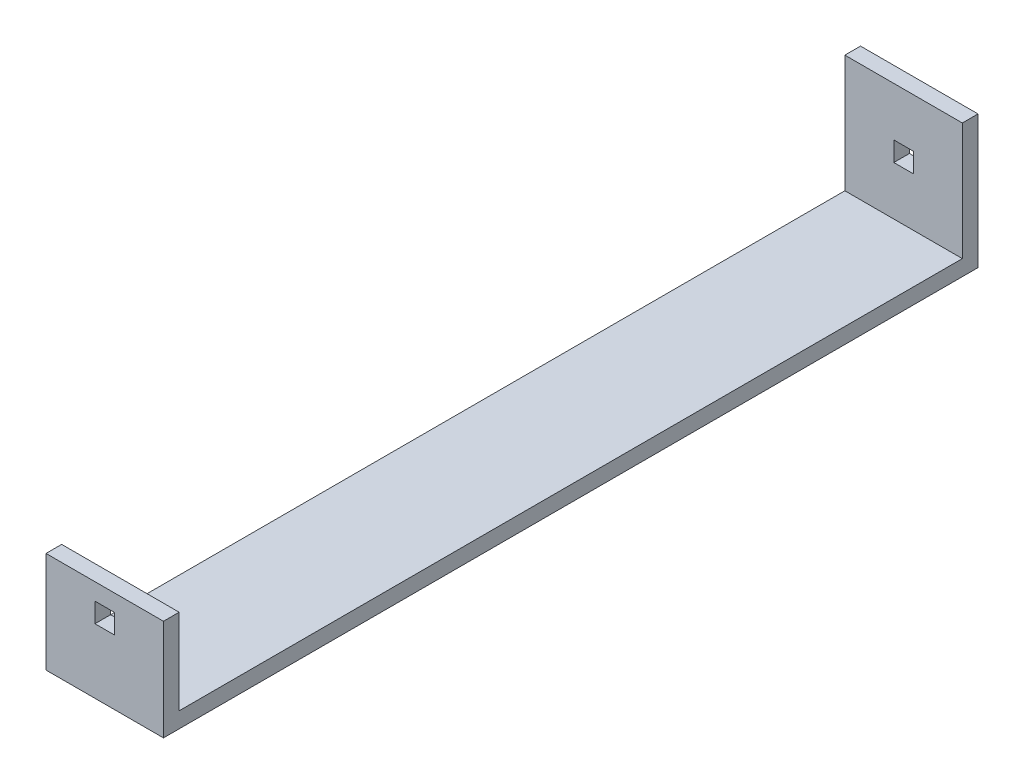
ISO-10303-21;
HEADER;
FILE_DESCRIPTION(('STEP AP214'),'2;1');
FILE_NAME('part.step','',(''),(''),'','','');
FILE_SCHEMA(('AUTOMOTIVE_DESIGN { 1 0 10303 214 1 1 1 1 }'));
ENDSEC;
DATA;
#1=APPLICATION_CONTEXT('core data for automotive mechanical design processes');
#2=APPLICATION_PROTOCOL_DEFINITION('international standard','automotive_design',2000,#1);
#3=PRODUCT_CONTEXT('',#1,'mechanical');
#4=PRODUCT('Part','Part','',(#3));
#5=PRODUCT_RELATED_PRODUCT_CATEGORY('part','',(#4));
#6=PRODUCT_DEFINITION_FORMATION('','',#4);
#7=PRODUCT_DEFINITION_CONTEXT('part definition',#1,'design');
#8=PRODUCT_DEFINITION('design','',#6,#7);
#9=PRODUCT_DEFINITION_SHAPE('','',#8);
#10=(LENGTH_UNIT() NAMED_UNIT(*) SI_UNIT(.MILLI.,.METRE.));
#11=(NAMED_UNIT(*) PLANE_ANGLE_UNIT() SI_UNIT($,.RADIAN.));
#12=(NAMED_UNIT(*) SI_UNIT($,.STERADIAN.) SOLID_ANGLE_UNIT());
#13=UNCERTAINTY_MEASURE_WITH_UNIT(LENGTH_MEASURE(1.E-05),#10,'distance_accuracy_value','');
#14=(GEOMETRIC_REPRESENTATION_CONTEXT(3) GLOBAL_UNCERTAINTY_ASSIGNED_CONTEXT((#13)) GLOBAL_UNIT_ASSIGNED_CONTEXT((#10,
#11,#12)) REPRESENTATION_CONTEXT('',''));
#15=CARTESIAN_POINT('',(0.,0.,0.));
#16=DIRECTION('',(0.,0.,1.));
#17=DIRECTION('',(1.,0.,0.));
#18=AXIS2_PLACEMENT_3D('',#15,#16,#17);
#19=CARTESIAN_POINT('',(0.,0.,0.));
#20=DIRECTION('',(0.,-1.,0.));
#21=DIRECTION('',(0.,0.,-1.));
#22=AXIS2_PLACEMENT_3D('',#19,#20,#21);
#23=PLANE('',#22);
#24=DIRECTION('',(1.,0.,0.));
#25=VECTOR('',#24,1.);
#26=CARTESIAN_POINT('',(-75.,0.,-500.));
#27=LINE('',#26,#25);
#28=CARTESIAN_POINT('',(-75.,0.,-500.));
#29=VERTEX_POINT('',#28);
#30=CARTESIAN_POINT('',(75.,0.,-500.));
#31=VERTEX_POINT('',#30);
#32=EDGE_CURVE('E177',#29,#31,#27,.T.);
#33=ORIENTED_EDGE('',*,*,#32,.F.);
#34=DIRECTION('',(0.,0.,1.));
#35=VECTOR('',#34,1.);
#36=CARTESIAN_POINT('',(-75.,0.,520.));
#37=LINE('',#36,#35);
#38=CARTESIAN_POINT('',(-75.,0.,500.));
#39=VERTEX_POINT('',#38);
#40=EDGE_CURVE('E175',#29,#39,#37,.T.);
#41=ORIENTED_EDGE('',*,*,#40,.T.);
#42=DIRECTION('',(-1.,0.,0.));
#43=VECTOR('',#42,1.);
#44=CARTESIAN_POINT('',(-75.,0.,500.));
#45=LINE('',#44,#43);
#46=CARTESIAN_POINT('',(75.,0.,500.));
#47=VERTEX_POINT('',#46);
#48=EDGE_CURVE('E172',#47,#39,#45,.T.);
#49=ORIENTED_EDGE('',*,*,#48,.F.);
#50=DIRECTION('',(0.,0.,-1.));
#51=VECTOR('',#50,1.);
#52=CARTESIAN_POINT('',(75.,0.,520.));
#53=LINE('',#52,#51);
#54=EDGE_CURVE('E184',#47,#31,#53,.T.);
#55=ORIENTED_EDGE('',*,*,#54,.T.);
#56=EDGE_LOOP('',(#33,#41,#49,#55));
#57=FACE_BOUND('',#56,.T.);
#58=ADVANCED_FACE('F39',(#57),#23,.F.);
#59=CARTESIAN_POINT('',(-75.,-20.,520.));
#60=DIRECTION('',(-1.,0.,0.));
#61=DIRECTION('',(0.,0.,1.));
#62=AXIS2_PLACEMENT_3D('',#59,#60,#61);
#63=PLANE('',#62);
#64=DIRECTION('',(0.,0.,1.));
#65=VECTOR('',#64,1.);
#66=CARTESIAN_POINT('',(-75.,109.,-520.001));
#67=LINE('',#66,#65);
#68=CARTESIAN_POINT('',(-75.,109.,500.));
#69=VERTEX_POINT('',#68);
#70=CARTESIAN_POINT('',(-75.,109.,520.));
#71=VERTEX_POINT('',#70);
#72=EDGE_CURVE('E153',#69,#71,#67,.T.);
#73=ORIENTED_EDGE('',*,*,#72,.F.);
#74=DIRECTION('',(0.,-1.,0.));
#75=VECTOR('',#74,1.);
#76=CARTESIAN_POINT('',(-75.,150.,500.));
#77=LINE('',#76,#75);
#78=EDGE_CURVE('E163',#69,#39,#77,.T.);
#79=ORIENTED_EDGE('',*,*,#78,.T.);
#80=ORIENTED_EDGE('',*,*,#40,.F.);
#81=DIRECTION('',(0.,-1.,0.));
#82=VECTOR('',#81,1.);
#83=CARTESIAN_POINT('',(-75.,150.,-500.));
#84=LINE('',#83,#82);
#85=CARTESIAN_POINT('',(-75.,150.,-500.));
#86=VERTEX_POINT('',#85);
#87=EDGE_CURVE('E262',#86,#29,#84,.T.);
#88=ORIENTED_EDGE('',*,*,#87,.F.);
#89=DIRECTION('',(0.,0.,1.));
#90=VECTOR('',#89,1.);
#91=CARTESIAN_POINT('',(-75.,150.,-520.));
#92=LINE('',#91,#90);
#93=CARTESIAN_POINT('',(-75.,150.,-520.));
#94=VERTEX_POINT('',#93);
#95=EDGE_CURVE('E273',#94,#86,#92,.T.);
#96=ORIENTED_EDGE('',*,*,#95,.F.);
#97=DIRECTION('',(0.,1.,0.));
#98=VECTOR('',#97,1.);
#99=CARTESIAN_POINT('',(-75.,-20.,-520.));
#100=LINE('',#99,#98);
#101=CARTESIAN_POINT('',(-75.,-20.,-520.));
#102=VERTEX_POINT('',#101);
#103=EDGE_CURVE('E195',#102,#94,#100,.T.);
#104=ORIENTED_EDGE('',*,*,#103,.F.);
#105=DIRECTION('',(0.,0.,1.));
#106=VECTOR('',#105,1.);
#107=CARTESIAN_POINT('',(-75.,-20.,520.));
#108=LINE('',#107,#106);
#109=CARTESIAN_POINT('',(-75.,-20.,520.));
#110=VERTEX_POINT('',#109);
#111=EDGE_CURVE('E181',#102,#110,#108,.T.);
#112=ORIENTED_EDGE('',*,*,#111,.T.);
#113=DIRECTION('',(0.,1.,0.));
#114=VECTOR('',#113,1.);
#115=CARTESIAN_POINT('',(-75.,-20.,520.));
#116=LINE('',#115,#114);
#117=EDGE_CURVE('E166',#110,#71,#116,.T.);
#118=ORIENTED_EDGE('',*,*,#117,.T.);
#119=EDGE_LOOP('',(#73,#79,#80,#88,#96,#104,#112,#118));
#120=FACE_BOUND('',#119,.T.);
#121=ADVANCED_FACE('F41',(#120),#63,.T.);
#122=CARTESIAN_POINT('',(-75.,-20.,-520.));
#123=DIRECTION('',(0.,0.,-1.));
#124=DIRECTION('',(-1.,0.,0.));
#125=AXIS2_PLACEMENT_3D('',#122,#123,#124);
#126=PLANE('',#125);
#127=DIRECTION('',(0.,1.,0.));
#128=VECTOR('',#127,1.);
#129=CARTESIAN_POINT('',(12.5,62.5,-520.));
#130=LINE('',#129,#128);
#131=CARTESIAN_POINT('',(12.5,62.5,-520.));
#132=VERTEX_POINT('',#131);
#133=CARTESIAN_POINT('',(12.5,87.5,-520.));
#134=VERTEX_POINT('',#133);
#135=EDGE_CURVE('E224',#132,#134,#130,.T.);
#136=ORIENTED_EDGE('',*,*,#135,.T.);
#137=DIRECTION('',(-1.,0.,0.));
#138=VECTOR('',#137,1.);
#139=CARTESIAN_POINT('',(-12.5,87.5,-520.));
#140=LINE('',#139,#138);
#141=CARTESIAN_POINT('',(-12.5,87.5,-520.));
#142=VERTEX_POINT('',#141);
#143=EDGE_CURVE('E327',#134,#142,#140,.T.);
#144=ORIENTED_EDGE('',*,*,#143,.T.);
#145=DIRECTION('',(0.,-1.,0.));
#146=VECTOR('',#145,1.);
#147=CARTESIAN_POINT('',(-12.5,62.5,-520.));
#148=LINE('',#147,#146);
#149=CARTESIAN_POINT('',(-12.5,62.5,-520.));
#150=VERTEX_POINT('',#149);
#151=EDGE_CURVE('E62',#142,#150,#148,.T.);
#152=ORIENTED_EDGE('',*,*,#151,.T.);
#153=DIRECTION('',(1.,0.,0.));
#154=VECTOR('',#153,1.);
#155=CARTESIAN_POINT('',(-12.5,62.5,-520.));
#156=LINE('',#155,#154);
#157=EDGE_CURVE('E235',#150,#132,#156,.T.);
#158=ORIENTED_EDGE('',*,*,#157,.T.);
#159=EDGE_LOOP('',(#136,#144,#152,#158));
#160=FACE_BOUND('',#159,.T.);
#161=ORIENTED_EDGE('',*,*,#103,.T.);
#162=DIRECTION('',(-1.,0.,0.));
#163=VECTOR('',#162,1.);
#164=CARTESIAN_POINT('',(-75.,150.,-520.));
#165=LINE('',#164,#163);
#166=CARTESIAN_POINT('',(75.,150.,-520.));
#167=VERTEX_POINT('',#166);
#168=EDGE_CURVE('E275',#167,#94,#165,.T.);
#169=ORIENTED_EDGE('',*,*,#168,.F.);
#170=DIRECTION('',(0.,1.,0.));
#171=VECTOR('',#170,1.);
#172=CARTESIAN_POINT('',(75.,-20.,-520.));
#173=LINE('',#172,#171);
#174=CARTESIAN_POINT('',(75.,-20.,-520.));
#175=VERTEX_POINT('',#174);
#176=EDGE_CURVE('E198',#175,#167,#173,.T.);
#177=ORIENTED_EDGE('',*,*,#176,.F.);
#178=DIRECTION('',(-1.,0.,0.));
#179=VECTOR('',#178,1.);
#180=CARTESIAN_POINT('',(-75.,-20.,-520.));
#181=LINE('',#180,#179);
#182=EDGE_CURVE('E190',#175,#102,#181,.T.);
#183=ORIENTED_EDGE('',*,*,#182,.T.);
#184=EDGE_LOOP('',(#161,#169,#177,#183));
#185=FACE_BOUND('',#184,.T.);
#186=ADVANCED_FACE('F291',(#160,#185),#126,.T.);
#187=CARTESIAN_POINT('',(75.,-20.,520.));
#188=DIRECTION('',(1.,0.,0.));
#189=DIRECTION('',(0.,0.,-1.));
#190=AXIS2_PLACEMENT_3D('',#187,#188,#189);
#191=PLANE('',#190);
#192=DIRECTION('',(0.,0.,1.));
#193=VECTOR('',#192,1.);
#194=CARTESIAN_POINT('',(75.,109.,-520.001));
#195=LINE('',#194,#193);
#196=CARTESIAN_POINT('',(75.,109.,500.));
#197=VERTEX_POINT('',#196);
#198=CARTESIAN_POINT('',(75.,109.,520.));
#199=VERTEX_POINT('',#198);
#200=EDGE_CURVE('E54',#197,#199,#195,.T.);
#201=ORIENTED_EDGE('',*,*,#200,.T.);
#202=DIRECTION('',(0.,1.,0.));
#203=VECTOR('',#202,1.);
#204=CARTESIAN_POINT('',(75.,-20.,520.));
#205=LINE('',#204,#203);
#206=CARTESIAN_POINT('',(75.,-20.,520.));
#207=VERTEX_POINT('',#206);
#208=EDGE_CURVE('E200',#207,#199,#205,.T.);
#209=ORIENTED_EDGE('',*,*,#208,.F.);
#210=DIRECTION('',(0.,0.,-1.));
#211=VECTOR('',#210,1.);
#212=CARTESIAN_POINT('',(75.,-20.,520.));
#213=LINE('',#212,#211);
#214=EDGE_CURVE('E187',#207,#175,#213,.T.);
#215=ORIENTED_EDGE('',*,*,#214,.T.);
#216=ORIENTED_EDGE('',*,*,#176,.T.);
#217=DIRECTION('',(0.,0.,-1.));
#218=VECTOR('',#217,1.);
#219=CARTESIAN_POINT('',(75.,150.,-500.));
#220=LINE('',#219,#218);
#221=CARTESIAN_POINT('',(75.,150.,-500.));
#222=VERTEX_POINT('',#221);
#223=EDGE_CURVE('E271',#222,#167,#220,.T.);
#224=ORIENTED_EDGE('',*,*,#223,.F.);
#225=DIRECTION('',(0.,-1.,0.));
#226=VECTOR('',#225,1.);
#227=CARTESIAN_POINT('',(75.,150.,-500.));
#228=LINE('',#227,#226);
#229=EDGE_CURVE('E265',#222,#31,#228,.T.);
#230=ORIENTED_EDGE('',*,*,#229,.T.);
#231=ORIENTED_EDGE('',*,*,#54,.F.);
#232=DIRECTION('',(0.,-1.,0.));
#233=VECTOR('',#232,1.);
#234=CARTESIAN_POINT('',(75.,150.,500.));
#235=LINE('',#234,#233);
#236=EDGE_CURVE('E173',#197,#47,#235,.T.);
#237=ORIENTED_EDGE('',*,*,#236,.F.);
#238=EDGE_LOOP('',(#201,#209,#215,#216,#224,#230,#231,#237));
#239=FACE_BOUND('',#238,.T.);
#240=ADVANCED_FACE('F286',(#239),#191,.T.);
#241=CARTESIAN_POINT('',(-75.,-20.,520.));
#242=DIRECTION('',(0.,0.,1.));
#243=DIRECTION('',(1.,0.,0.));
#244=AXIS2_PLACEMENT_3D('',#241,#242,#243);
#245=PLANE('',#244);
#246=DIRECTION('',(1.,0.,0.));
#247=VECTOR('',#246,1.);
#248=CARTESIAN_POINT('',(-75.,109.,520.));
#249=LINE('',#248,#247);
#250=EDGE_CURVE('E167',#71,#199,#249,.T.);
#251=ORIENTED_EDGE('',*,*,#250,.F.);
#252=ORIENTED_EDGE('',*,*,#117,.F.);
#253=DIRECTION('',(1.,0.,0.));
#254=VECTOR('',#253,1.);
#255=CARTESIAN_POINT('',(-75.,-20.,520.));
#256=LINE('',#255,#254);
#257=EDGE_CURVE('E183',#110,#207,#256,.T.);
#258=ORIENTED_EDGE('',*,*,#257,.T.);
#259=ORIENTED_EDGE('',*,*,#208,.T.);
#260=EDGE_LOOP('',(#251,#252,#258,#259));
#261=FACE_BOUND('',#260,.T.);
#262=DIRECTION('',(0.,1.,0.));
#263=VECTOR('',#262,1.);
#264=CARTESIAN_POINT('',(12.5,-20.,520.));
#265=LINE('',#264,#263);
#266=CARTESIAN_POINT('',(12.5,62.5,520.));
#267=VERTEX_POINT('',#266);
#268=CARTESIAN_POINT('',(12.5,87.5,520.));
#269=VERTEX_POINT('',#268);
#270=EDGE_CURVE('E259',#267,#269,#265,.T.);
#271=ORIENTED_EDGE('',*,*,#270,.F.);
#272=DIRECTION('',(1.,0.,0.));
#273=VECTOR('',#272,1.);
#274=CARTESIAN_POINT('',(-75.,62.5,520.));
#275=LINE('',#274,#273);
#276=CARTESIAN_POINT('',(-12.5,62.5,520.));
#277=VERTEX_POINT('',#276);
#278=EDGE_CURVE('E254',#277,#267,#275,.T.);
#279=ORIENTED_EDGE('',*,*,#278,.F.);
#280=DIRECTION('',(0.,-1.,0.));
#281=VECTOR('',#280,1.);
#282=CARTESIAN_POINT('',(-12.5,-20.,520.));
#283=LINE('',#282,#281);
#284=CARTESIAN_POINT('',(-12.5,87.5,520.));
#285=VERTEX_POINT('',#284);
#286=EDGE_CURVE('E249',#285,#277,#283,.T.);
#287=ORIENTED_EDGE('',*,*,#286,.F.);
#288=DIRECTION('',(-1.,0.,0.));
#289=VECTOR('',#288,1.);
#290=CARTESIAN_POINT('',(-75.,87.5,520.));
#291=LINE('',#290,#289);
#292=EDGE_CURVE('E230',#269,#285,#291,.T.);
#293=ORIENTED_EDGE('',*,*,#292,.F.);
#294=EDGE_LOOP('',(#271,#279,#287,#293));
#295=FACE_BOUND('',#294,.T.);
#296=ADVANCED_FACE('F298',(#261,#295),#245,.T.);
#297=CARTESIAN_POINT('',(0.,-20.,0.));
#298=DIRECTION('',(0.,-1.,0.));
#299=DIRECTION('',(0.,0.,-1.));
#300=AXIS2_PLACEMENT_3D('',#297,#298,#299);
#301=PLANE('',#300);
#302=CARTESIAN_POINT('',(54.9999999999999,-20.,-500.));
#303=DIRECTION('',(0.,-1.,0.));
#304=DIRECTION('',(0.,0.,-1.));
#305=AXIS2_PLACEMENT_3D('',#302,#303,#304);
#306=CIRCLE('',#305,6.);
#307=CARTESIAN_POINT('',(54.9999999999999,-20.,-506.));
#308=VERTEX_POINT('',#307);
#309=EDGE_CURVE('E303',#308,#308,#306,.T.);
#310=ORIENTED_EDGE('',*,*,#309,.F.);
#311=EDGE_LOOP('',(#310));
#312=FACE_BOUND('',#311,.T.);
#313=CARTESIAN_POINT('',(-54.9999999999999,-20.,-500.));
#314=DIRECTION('',(0.,-1.,0.));
#315=DIRECTION('',(0.,0.,-1.));
#316=AXIS2_PLACEMENT_3D('',#313,#314,#315);
#317=CIRCLE('',#316,6.);
#318=CARTESIAN_POINT('',(-54.9999999999999,-20.,-506.));
#319=VERTEX_POINT('',#318);
#320=EDGE_CURVE('E309',#319,#319,#317,.T.);
#321=ORIENTED_EDGE('',*,*,#320,.F.);
#322=EDGE_LOOP('',(#321));
#323=FACE_BOUND('',#322,.T.);
#324=CARTESIAN_POINT('',(54.9999999999999,-20.,500.));
#325=DIRECTION('',(0.,-1.,0.));
#326=DIRECTION('',(0.,0.,-1.));
#327=AXIS2_PLACEMENT_3D('',#324,#325,#326);
#328=CIRCLE('',#327,6.);
#329=CARTESIAN_POINT('',(54.9999999999999,-20.,494.));
#330=VERTEX_POINT('',#329);
#331=EDGE_CURVE('E315',#330,#330,#328,.T.);
#332=ORIENTED_EDGE('',*,*,#331,.F.);
#333=EDGE_LOOP('',(#332));
#334=FACE_BOUND('',#333,.T.);
#335=CARTESIAN_POINT('',(-54.9999999999999,-20.,500.));
#336=DIRECTION('',(0.,-1.,0.));
#337=DIRECTION('',(0.,0.,-1.));
#338=AXIS2_PLACEMENT_3D('',#335,#336,#337);
#339=CIRCLE('',#338,6.);
#340=CARTESIAN_POINT('',(-54.9999999999999,-20.,494.));
#341=VERTEX_POINT('',#340);
#342=EDGE_CURVE('E318',#341,#341,#339,.T.);
#343=ORIENTED_EDGE('',*,*,#342,.F.);
#344=EDGE_LOOP('',(#343));
#345=FACE_BOUND('',#344,.T.);
#346=ORIENTED_EDGE('',*,*,#111,.F.);
#347=ORIENTED_EDGE('',*,*,#182,.F.);
#348=ORIENTED_EDGE('',*,*,#214,.F.);
#349=ORIENTED_EDGE('',*,*,#257,.F.);
#350=EDGE_LOOP('',(#346,#347,#348,#349));
#351=FACE_BOUND('',#350,.T.);
#352=ADVANCED_FACE('F296',(#312,#323,#334,#345,#351),#301,.T.);
#353=CARTESIAN_POINT('',(-75.,150.,500.));
#354=DIRECTION('',(0.,0.,1.));
#355=DIRECTION('',(1.,0.,0.));
#356=AXIS2_PLACEMENT_3D('',#353,#354,#355);
#357=PLANE('',#356);
#358=DIRECTION('',(1.,0.,0.));
#359=VECTOR('',#358,1.);
#360=CARTESIAN_POINT('',(-75.,62.5,500.));
#361=LINE('',#360,#359);
#362=CARTESIAN_POINT('',(-12.5,62.5,500.));
#363=VERTEX_POINT('',#362);
#364=CARTESIAN_POINT('',(12.5,62.5,500.));
#365=VERTEX_POINT('',#364);
#366=EDGE_CURVE('E251',#363,#365,#361,.T.);
#367=ORIENTED_EDGE('',*,*,#366,.T.);
#368=DIRECTION('',(0.,1.,0.));
#369=VECTOR('',#368,1.);
#370=CARTESIAN_POINT('',(12.5,150.,500.));
#371=LINE('',#370,#369);
#372=CARTESIAN_POINT('',(12.5,87.5,500.));
#373=VERTEX_POINT('',#372);
#374=EDGE_CURVE('E256',#365,#373,#371,.T.);
#375=ORIENTED_EDGE('',*,*,#374,.T.);
#376=DIRECTION('',(-1.,0.,0.));
#377=VECTOR('',#376,1.);
#378=CARTESIAN_POINT('',(-75.,87.5,500.));
#379=LINE('',#378,#377);
#380=CARTESIAN_POINT('',(-12.5,87.5,500.));
#381=VERTEX_POINT('',#380);
#382=EDGE_CURVE('E226',#373,#381,#379,.T.);
#383=ORIENTED_EDGE('',*,*,#382,.T.);
#384=DIRECTION('',(0.,-1.,0.));
#385=VECTOR('',#384,1.);
#386=CARTESIAN_POINT('',(-12.5,150.,500.));
#387=LINE('',#386,#385);
#388=EDGE_CURVE('E246',#381,#363,#387,.T.);
#389=ORIENTED_EDGE('',*,*,#388,.T.);
#390=EDGE_LOOP('',(#367,#375,#383,#389));
#391=FACE_BOUND('',#390,.T.);
#392=ORIENTED_EDGE('',*,*,#78,.F.);
#393=DIRECTION('',(-1.,0.,0.));
#394=VECTOR('',#393,1.);
#395=CARTESIAN_POINT('',(-75.,109.,500.));
#396=LINE('',#395,#394);
#397=EDGE_CURVE('E150',#197,#69,#396,.T.);
#398=ORIENTED_EDGE('',*,*,#397,.F.);
#399=ORIENTED_EDGE('',*,*,#236,.T.);
#400=ORIENTED_EDGE('',*,*,#48,.T.);
#401=EDGE_LOOP('',(#392,#398,#399,#400));
#402=FACE_BOUND('',#401,.T.);
#403=ADVANCED_FACE('F170',(#391,#402),#357,.F.);
#404=CARTESIAN_POINT('',(-75.,150.,-500.));
#405=DIRECTION('',(0.,0.,-1.));
#406=DIRECTION('',(-1.,0.,0.));
#407=AXIS2_PLACEMENT_3D('',#404,#405,#406);
#408=PLANE('',#407);
#409=DIRECTION('',(1.,0.,0.));
#410=VECTOR('',#409,1.);
#411=CARTESIAN_POINT('',(-75.,87.5,-500.));
#412=LINE('',#411,#410);
#413=CARTESIAN_POINT('',(-12.5,87.5,-500.));
#414=VERTEX_POINT('',#413);
#415=CARTESIAN_POINT('',(12.5,87.5,-500.));
#416=VERTEX_POINT('',#415);
#417=EDGE_CURVE('E197',#414,#416,#412,.T.);
#418=ORIENTED_EDGE('',*,*,#417,.T.);
#419=DIRECTION('',(0.,-1.,0.));
#420=VECTOR('',#419,1.);
#421=CARTESIAN_POINT('',(12.5,150.,-500.));
#422=LINE('',#421,#420);
#423=CARTESIAN_POINT('',(12.5,62.5,-500.));
#424=VERTEX_POINT('',#423);
#425=EDGE_CURVE('E11',#416,#424,#422,.T.);
#426=ORIENTED_EDGE('',*,*,#425,.T.);
#427=DIRECTION('',(-1.,0.,0.));
#428=VECTOR('',#427,1.);
#429=CARTESIAN_POINT('',(-75.,62.5,-500.));
#430=LINE('',#429,#428);
#431=CARTESIAN_POINT('',(-12.5,62.5,-500.));
#432=VERTEX_POINT('',#431);
#433=EDGE_CURVE('E47',#424,#432,#430,.T.);
#434=ORIENTED_EDGE('',*,*,#433,.T.);
#435=DIRECTION('',(0.,1.,0.));
#436=VECTOR('',#435,1.);
#437=CARTESIAN_POINT('',(-12.5,150.,-500.));
#438=LINE('',#437,#436);
#439=EDGE_CURVE('E206',#432,#414,#438,.T.);
#440=ORIENTED_EDGE('',*,*,#439,.T.);
#441=EDGE_LOOP('',(#418,#426,#434,#440));
#442=FACE_BOUND('',#441,.T.);
#443=ORIENTED_EDGE('',*,*,#32,.T.);
#444=ORIENTED_EDGE('',*,*,#229,.F.);
#445=DIRECTION('',(1.,0.,0.));
#446=VECTOR('',#445,1.);
#447=CARTESIAN_POINT('',(-75.,150.,-500.));
#448=LINE('',#447,#446);
#449=EDGE_CURVE('E268',#86,#222,#448,.T.);
#450=ORIENTED_EDGE('',*,*,#449,.F.);
#451=ORIENTED_EDGE('',*,*,#87,.T.);
#452=EDGE_LOOP('',(#443,#444,#450,#451));
#453=FACE_BOUND('',#452,.T.);
#454=ADVANCED_FACE('F210',(#442,#453),#408,.F.);
#455=CARTESIAN_POINT('',(0.,150.,0.));
#456=DIRECTION('',(0.,-1.,0.));
#457=DIRECTION('',(0.,0.,-1.));
#458=AXIS2_PLACEMENT_3D('',#455,#456,#457);
#459=PLANE('',#458);
#460=ORIENTED_EDGE('',*,*,#223,.T.);
#461=ORIENTED_EDGE('',*,*,#168,.T.);
#462=ORIENTED_EDGE('',*,*,#95,.T.);
#463=ORIENTED_EDGE('',*,*,#449,.T.);
#464=EDGE_LOOP('',(#460,#461,#462,#463));
#465=FACE_BOUND('',#464,.T.);
#466=ADVANCED_FACE('F280',(#465),#459,.F.);
#467=CARTESIAN_POINT('',(-12.5,87.5,-520.));
#468=DIRECTION('',(0.,1.,0.));
#469=DIRECTION('',(0.,0.,1.));
#470=AXIS2_PLACEMENT_3D('',#467,#468,#469);
#471=PLANE('',#470);
#472=DIRECTION('',(0.,0.,1.));
#473=VECTOR('',#472,1.);
#474=CARTESIAN_POINT('',(-12.5,87.5,-520.));
#475=LINE('',#474,#473);
#476=EDGE_CURVE('E239',#142,#414,#475,.T.);
#477=ORIENTED_EDGE('',*,*,#476,.F.);
#478=ORIENTED_EDGE('',*,*,#143,.F.);
#479=DIRECTION('',(0.,0.,1.));
#480=VECTOR('',#479,1.);
#481=CARTESIAN_POINT('',(12.5,87.5,-520.));
#482=LINE('',#481,#480);
#483=EDGE_CURVE('E242',#134,#416,#482,.T.);
#484=ORIENTED_EDGE('',*,*,#483,.T.);
#485=ORIENTED_EDGE('',*,*,#417,.F.);
#486=EDGE_LOOP('',(#477,#478,#484,#485));
#487=FACE_BOUND('',#486,.T.);
#488=ADVANCED_FACE('F488',(#487),#471,.F.);
#489=CARTESIAN_POINT('',(-12.5,62.5,-520.));
#490=DIRECTION('',(-1.,0.,0.));
#491=DIRECTION('',(0.,0.,1.));
#492=AXIS2_PLACEMENT_3D('',#489,#490,#491);
#493=PLANE('',#492);
#494=DIRECTION('',(0.,0.,1.));
#495=VECTOR('',#494,1.);
#496=CARTESIAN_POINT('',(-12.5,62.5,-520.));
#497=LINE('',#496,#495);
#498=EDGE_CURVE('E220',#150,#432,#497,.T.);
#499=ORIENTED_EDGE('',*,*,#498,.F.);
#500=ORIENTED_EDGE('',*,*,#151,.F.);
#501=ORIENTED_EDGE('',*,*,#476,.T.);
#502=ORIENTED_EDGE('',*,*,#439,.F.);
#503=EDGE_LOOP('',(#499,#500,#501,#502));
#504=FACE_BOUND('',#503,.T.);
#505=ADVANCED_FACE('F498',(#504),#493,.F.);
#506=CARTESIAN_POINT('',(-12.5,62.5,-520.));
#507=DIRECTION('',(0.,-1.,0.));
#508=DIRECTION('',(0.,0.,-1.));
#509=AXIS2_PLACEMENT_3D('',#506,#507,#508);
#510=PLANE('',#509);
#511=DIRECTION('',(0.,0.,1.));
#512=VECTOR('',#511,1.);
#513=CARTESIAN_POINT('',(12.5,62.5,-520.));
#514=LINE('',#513,#512);
#515=EDGE_CURVE('E218',#132,#424,#514,.T.);
#516=ORIENTED_EDGE('',*,*,#515,.F.);
#517=ORIENTED_EDGE('',*,*,#157,.F.);
#518=ORIENTED_EDGE('',*,*,#498,.T.);
#519=ORIENTED_EDGE('',*,*,#433,.F.);
#520=EDGE_LOOP('',(#516,#517,#518,#519));
#521=FACE_BOUND('',#520,.T.);
#522=ADVANCED_FACE('F216',(#521),#510,.F.);
#523=CARTESIAN_POINT('',(12.5,62.5,-520.));
#524=DIRECTION('',(1.,0.,0.));
#525=DIRECTION('',(0.,0.,-1.));
#526=AXIS2_PLACEMENT_3D('',#523,#524,#525);
#527=PLANE('',#526);
#528=ORIENTED_EDGE('',*,*,#483,.F.);
#529=ORIENTED_EDGE('',*,*,#135,.F.);
#530=ORIENTED_EDGE('',*,*,#515,.T.);
#531=ORIENTED_EDGE('',*,*,#425,.F.);
#532=EDGE_LOOP('',(#528,#529,#530,#531));
#533=FACE_BOUND('',#532,.T.);
#534=ADVANCED_FACE('F222',(#533),#527,.F.);
#535=ORIENTED_EDGE('',*,*,#270,.T.);
#536=EDGE_CURVE('E243',#373,#269,#482,.T.);
#537=ORIENTED_EDGE('',*,*,#536,.F.);
#538=ORIENTED_EDGE('',*,*,#374,.F.);
#539=EDGE_CURVE('E227',#365,#267,#514,.T.);
#540=ORIENTED_EDGE('',*,*,#539,.T.);
#541=EDGE_LOOP('',(#535,#537,#538,#540));
#542=FACE_BOUND('',#541,.T.);
#543=ADVANCED_FACE('F337',(#542),#527,.F.);
#544=ORIENTED_EDGE('',*,*,#278,.T.);
#545=ORIENTED_EDGE('',*,*,#539,.F.);
#546=ORIENTED_EDGE('',*,*,#366,.F.);
#547=EDGE_CURVE('E238',#363,#277,#497,.T.);
#548=ORIENTED_EDGE('',*,*,#547,.T.);
#549=EDGE_LOOP('',(#544,#545,#546,#548));
#550=FACE_BOUND('',#549,.T.);
#551=ADVANCED_FACE('F347',(#550),#510,.F.);
#552=ORIENTED_EDGE('',*,*,#286,.T.);
#553=ORIENTED_EDGE('',*,*,#547,.F.);
#554=ORIENTED_EDGE('',*,*,#388,.F.);
#555=EDGE_CURVE('E241',#381,#285,#475,.T.);
#556=ORIENTED_EDGE('',*,*,#555,.T.);
#557=EDGE_LOOP('',(#552,#553,#554,#556));
#558=FACE_BOUND('',#557,.T.);
#559=ADVANCED_FACE('F344',(#558),#493,.F.);
#560=ORIENTED_EDGE('',*,*,#292,.T.);
#561=ORIENTED_EDGE('',*,*,#555,.F.);
#562=ORIENTED_EDGE('',*,*,#382,.F.);
#563=ORIENTED_EDGE('',*,*,#536,.T.);
#564=EDGE_LOOP('',(#560,#561,#562,#563));
#565=FACE_BOUND('',#564,.T.);
#566=ADVANCED_FACE('F332',(#565),#471,.F.);
#567=CARTESIAN_POINT('',(-54.9999999999999,-30.,500.));
#568=DIRECTION('',(0.,1.,0.));
#569=DIRECTION('',(0.,0.,1.));
#570=AXIS2_PLACEMENT_3D('',#567,#568,#569);
#571=CYLINDRICAL_SURFACE('',#570,6.);
#572=CARTESIAN_POINT('',(-54.9999999999999,-30.,500.));
#573=DIRECTION('',(0.,-1.,0.));
#574=DIRECTION('',(0.,0.,-1.));
#575=AXIS2_PLACEMENT_3D('',#572,#573,#574);
#576=CIRCLE('',#575,6.);
#577=CARTESIAN_POINT('',(-54.9999999999999,-30.,494.));
#578=VERTEX_POINT('',#577);
#579=EDGE_CURVE('E321',#578,#578,#576,.T.);
#580=ORIENTED_EDGE('',*,*,#579,.F.);
#581=EDGE_LOOP('',(#580));
#582=FACE_BOUND('',#581,.T.);
#583=ORIENTED_EDGE('',*,*,#342,.T.);
#584=EDGE_LOOP('',(#583));
#585=FACE_BOUND('',#584,.T.);
#586=ADVANCED_FACE('F457',(#582,#585),#571,.T.);
#587=CARTESIAN_POINT('',(-54.9999999999999,-30.,500.));
#588=DIRECTION('',(0.,-1.,0.));
#589=DIRECTION('',(0.,0.,-1.));
#590=AXIS2_PLACEMENT_3D('',#587,#588,#589);
#591=PLANE('',#590);
#592=ORIENTED_EDGE('',*,*,#579,.T.);
#593=EDGE_LOOP('',(#592));
#594=FACE_BOUND('',#593,.T.);
#595=ADVANCED_FACE('F446',(#594),#591,.T.);
#596=CARTESIAN_POINT('',(54.9999999999999,-30.,500.));
#597=DIRECTION('',(0.,1.,0.));
#598=DIRECTION('',(0.,0.,1.));
#599=AXIS2_PLACEMENT_3D('',#596,#597,#598);
#600=CYLINDRICAL_SURFACE('',#599,6.);
#601=CARTESIAN_POINT('',(54.9999999999999,-30.,500.));
#602=DIRECTION('',(0.,-1.,0.));
#603=DIRECTION('',(0.,0.,-1.));
#604=AXIS2_PLACEMENT_3D('',#601,#602,#603);
#605=CIRCLE('',#604,6.);
#606=CARTESIAN_POINT('',(54.9999999999999,-30.,494.));
#607=VERTEX_POINT('',#606);
#608=EDGE_CURVE('E312',#607,#607,#605,.T.);
#609=ORIENTED_EDGE('',*,*,#608,.F.);
#610=EDGE_LOOP('',(#609));
#611=FACE_BOUND('',#610,.T.);
#612=ORIENTED_EDGE('',*,*,#331,.T.);
#613=EDGE_LOOP('',(#612));
#614=FACE_BOUND('',#613,.T.);
#615=ADVANCED_FACE('F435',(#611,#614),#600,.T.);
#616=CARTESIAN_POINT('',(54.9999999999999,-30.,500.));
#617=DIRECTION('',(0.,-1.,0.));
#618=DIRECTION('',(0.,0.,-1.));
#619=AXIS2_PLACEMENT_3D('',#616,#617,#618);
#620=PLANE('',#619);
#621=ORIENTED_EDGE('',*,*,#608,.T.);
#622=EDGE_LOOP('',(#621));
#623=FACE_BOUND('',#622,.T.);
#624=ADVANCED_FACE('F424',(#623),#620,.T.);
#625=CARTESIAN_POINT('',(-54.9999999999999,-30.,-500.));
#626=DIRECTION('',(0.,1.,0.));
#627=DIRECTION('',(0.,0.,1.));
#628=AXIS2_PLACEMENT_3D('',#625,#626,#627);
#629=CYLINDRICAL_SURFACE('',#628,6.);
#630=CARTESIAN_POINT('',(-54.9999999999999,-30.,-500.));
#631=DIRECTION('',(0.,-1.,0.));
#632=DIRECTION('',(0.,0.,-1.));
#633=AXIS2_PLACEMENT_3D('',#630,#631,#632);
#634=CIRCLE('',#633,6.);
#635=CARTESIAN_POINT('',(-54.9999999999999,-30.,-506.));
#636=VERTEX_POINT('',#635);
#637=EDGE_CURVE('E306',#636,#636,#634,.T.);
#638=ORIENTED_EDGE('',*,*,#637,.F.);
#639=EDGE_LOOP('',(#638));
#640=FACE_BOUND('',#639,.T.);
#641=ORIENTED_EDGE('',*,*,#320,.T.);
#642=EDGE_LOOP('',(#641));
#643=FACE_BOUND('',#642,.T.);
#644=ADVANCED_FACE('F413',(#640,#643),#629,.T.);
#645=CARTESIAN_POINT('',(-54.9999999999999,-30.,-500.));
#646=DIRECTION('',(0.,-1.,0.));
#647=DIRECTION('',(0.,0.,-1.));
#648=AXIS2_PLACEMENT_3D('',#645,#646,#647);
#649=PLANE('',#648);
#650=ORIENTED_EDGE('',*,*,#637,.T.);
#651=EDGE_LOOP('',(#650));
#652=FACE_BOUND('',#651,.T.);
#653=ADVANCED_FACE('F402',(#652),#649,.T.);
#654=CARTESIAN_POINT('',(54.9999999999999,-30.,-500.));
#655=DIRECTION('',(0.,1.,0.));
#656=DIRECTION('',(0.,0.,1.));
#657=AXIS2_PLACEMENT_3D('',#654,#655,#656);
#658=CYLINDRICAL_SURFACE('',#657,6.);
#659=CARTESIAN_POINT('',(54.9999999999999,-30.,-500.));
#660=DIRECTION('',(0.,-1.,0.));
#661=DIRECTION('',(0.,0.,-1.));
#662=AXIS2_PLACEMENT_3D('',#659,#660,#661);
#663=CIRCLE('',#662,6.);
#664=CARTESIAN_POINT('',(54.9999999999999,-30.,-506.));
#665=VERTEX_POINT('',#664);
#666=EDGE_CURVE('E158',#665,#665,#663,.T.);
#667=ORIENTED_EDGE('',*,*,#666,.F.);
#668=EDGE_LOOP('',(#667));
#669=FACE_BOUND('',#668,.T.);
#670=ORIENTED_EDGE('',*,*,#309,.T.);
#671=EDGE_LOOP('',(#670));
#672=FACE_BOUND('',#671,.T.);
#673=ADVANCED_FACE('F389',(#669,#672),#658,.T.);
#674=CARTESIAN_POINT('',(54.9999999999999,-30.,-500.));
#675=DIRECTION('',(0.,-1.,0.));
#676=DIRECTION('',(0.,0.,-1.));
#677=AXIS2_PLACEMENT_3D('',#674,#675,#676);
#678=PLANE('',#677);
#679=ORIENTED_EDGE('',*,*,#666,.T.);
#680=EDGE_LOOP('',(#679));
#681=FACE_BOUND('',#680,.T.);
#682=ADVANCED_FACE('F384',(#681),#678,.T.);
#683=CARTESIAN_POINT('',(-75.,109.,-520.001));
#684=DIRECTION('',(0.,-1.,0.));
#685=DIRECTION('',(0.,0.,-1.));
#686=AXIS2_PLACEMENT_3D('',#683,#684,#685);
#687=PLANE('',#686);
#688=ORIENTED_EDGE('',*,*,#397,.T.);
#689=ORIENTED_EDGE('',*,*,#72,.T.);
#690=ORIENTED_EDGE('',*,*,#250,.T.);
#691=ORIENTED_EDGE('',*,*,#200,.F.);
#692=EDGE_LOOP('',(#688,#689,#690,#691));
#693=FACE_BOUND('',#692,.T.);
#694=ADVANCED_FACE('F152',(#693),#687,.F.);
#695=CLOSED_SHELL('',(#58,#121,#186,#240,#296,#352,#403,#454,#466,#488,#505,#522,#534,#543,#551,
#559,#566,#586,#595,#615,#624,#644,#653,#673,#682,#694));
#696=MANIFOLD_SOLID_BREP('B2',#695);
#697=ADVANCED_BREP_SHAPE_REPRESENTATION('',(#18,#696),#14);
#698=SHAPE_DEFINITION_REPRESENTATION(#9,#697);
ENDSEC;
END-ISO-10303-21;
